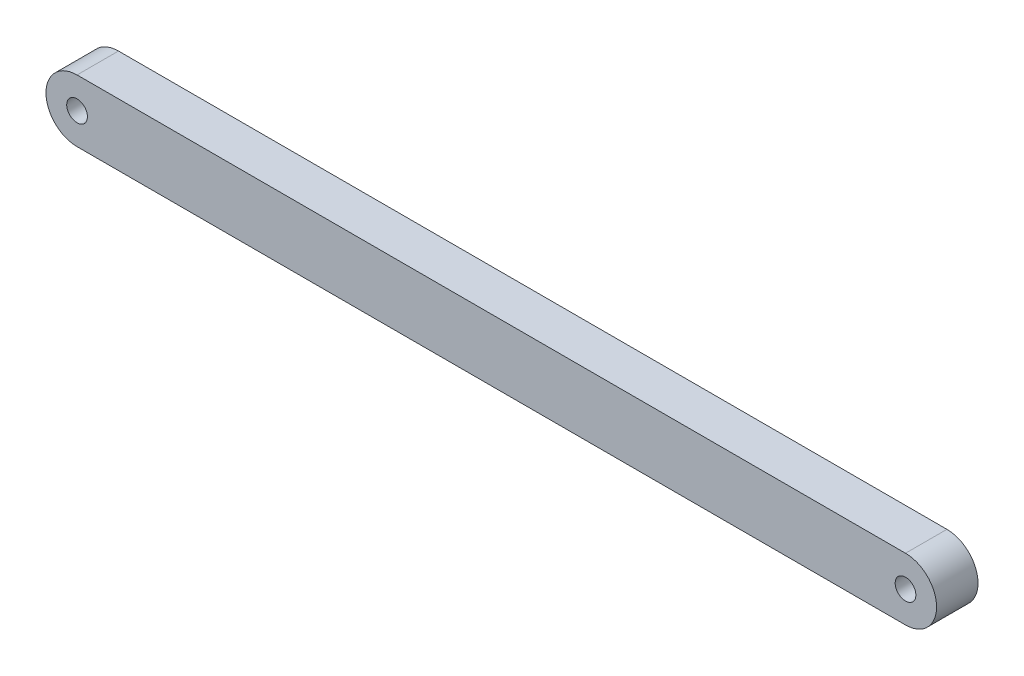
ISO-10303-21;
HEADER;
FILE_DESCRIPTION(('STEP AP214'),'2;1');
FILE_NAME('part.step','',(''),(''),'','','');
FILE_SCHEMA(('AUTOMOTIVE_DESIGN { 1 0 10303 214 1 1 1 1 }'));
ENDSEC;
DATA;
#1=APPLICATION_CONTEXT('core data for automotive mechanical design processes');
#2=APPLICATION_PROTOCOL_DEFINITION('international standard','automotive_design',2000,#1);
#3=PRODUCT_CONTEXT('',#1,'mechanical');
#4=PRODUCT('Part','Part','',(#3));
#5=PRODUCT_RELATED_PRODUCT_CATEGORY('part','',(#4));
#6=PRODUCT_DEFINITION_FORMATION('','',#4);
#7=PRODUCT_DEFINITION_CONTEXT('part definition',#1,'design');
#8=PRODUCT_DEFINITION('design','',#6,#7);
#9=PRODUCT_DEFINITION_SHAPE('','',#8);
#10=(LENGTH_UNIT() NAMED_UNIT(*) SI_UNIT(.MILLI.,.METRE.));
#11=(NAMED_UNIT(*) PLANE_ANGLE_UNIT() SI_UNIT($,.RADIAN.));
#12=(NAMED_UNIT(*) SI_UNIT($,.STERADIAN.) SOLID_ANGLE_UNIT());
#13=UNCERTAINTY_MEASURE_WITH_UNIT(LENGTH_MEASURE(1.E-05),#10,'distance_accuracy_value','');
#14=(GEOMETRIC_REPRESENTATION_CONTEXT(3) GLOBAL_UNCERTAINTY_ASSIGNED_CONTEXT((#13)) GLOBAL_UNIT_ASSIGNED_CONTEXT((#10,
#11,#12)) REPRESENTATION_CONTEXT('',''));
#15=CARTESIAN_POINT('',(0.,0.,0.));
#16=DIRECTION('',(0.,0.,1.));
#17=DIRECTION('',(1.,0.,0.));
#18=AXIS2_PLACEMENT_3D('',#15,#16,#17);
#19=CARTESIAN_POINT('',(-26.147603505701,20.515129689902,2.));
#20=DIRECTION('',(0.,0.,1.));
#21=DIRECTION('',(1.,0.,0.));
#22=AXIS2_PLACEMENT_3D('',#19,#20,#21);
#23=PLANE('',#22);
#24=CARTESIAN_POINT('',(-26.147603505701,20.515129689902,2.));
#25=DIRECTION('',(0.,0.,1.));
#26=DIRECTION('',(1.,0.,0.));
#27=AXIS2_PLACEMENT_3D('',#24,#25,#26);
#28=CIRCLE('',#27,0.499999999999999);
#29=CARTESIAN_POINT('',(-25.647603505701,20.515129689902,2.));
#30=VERTEX_POINT('',#29);
#31=EDGE_CURVE('E108',#30,#30,#28,.T.);
#32=ORIENTED_EDGE('',*,*,#31,.F.);
#33=EDGE_LOOP('',(#32));
#34=FACE_BOUND('',#33,.T.);
#35=CARTESIAN_POINT('',(-26.147603505701,20.515129689902,2.));
#36=DIRECTION('',(0.,0.,1.));
#37=DIRECTION('',(1.,0.,0.));
#38=AXIS2_PLACEMENT_3D('',#35,#36,#37);
#39=CIRCLE('',#38,1.5);
#40=CARTESIAN_POINT('',(-26.147603505701,22.015129689902,2.));
#41=VERTEX_POINT('',#40);
#42=CARTESIAN_POINT('',(-26.147603505701,19.015129689902,2.));
#43=VERTEX_POINT('',#42);
#44=EDGE_CURVE('E93',#41,#43,#39,.T.);
#45=ORIENTED_EDGE('',*,*,#44,.T.);
#46=DIRECTION('',(1.,0.,0.));
#47=VECTOR('',#46,1.);
#48=CARTESIAN_POINT('',(13.852396494299,19.015129689902,2.));
#49=LINE('',#48,#47);
#50=CARTESIAN_POINT('',(13.852396494299,19.015129689902,2.));
#51=VERTEX_POINT('',#50);
#52=EDGE_CURVE('E88',#43,#51,#49,.T.);
#53=ORIENTED_EDGE('',*,*,#52,.T.);
#54=CARTESIAN_POINT('',(13.852396494299,20.515129689902,2.));
#55=DIRECTION('',(0.,0.,1.));
#56=DIRECTION('',(1.,0.,0.));
#57=AXIS2_PLACEMENT_3D('',#54,#55,#56);
#58=CIRCLE('',#57,1.5);
#59=CARTESIAN_POINT('',(13.852396494299,22.015129689902,2.));
#60=VERTEX_POINT('',#59);
#61=EDGE_CURVE('E91',#51,#60,#58,.T.);
#62=ORIENTED_EDGE('',*,*,#61,.T.);
#63=DIRECTION('',(-1.,0.,0.));
#64=VECTOR('',#63,1.);
#65=CARTESIAN_POINT('',(-26.147603505701,22.015129689902,2.));
#66=LINE('',#65,#64);
#67=EDGE_CURVE('E58',#60,#41,#66,.T.);
#68=ORIENTED_EDGE('',*,*,#67,.T.);
#69=EDGE_LOOP('',(#45,#53,#62,#68));
#70=FACE_BOUND('',#69,.T.);
#71=CARTESIAN_POINT('',(13.852396494299,20.515129689902,2.));
#72=DIRECTION('',(0.,0.,1.));
#73=DIRECTION('',(1.,0.,0.));
#74=AXIS2_PLACEMENT_3D('',#71,#72,#73);
#75=CIRCLE('',#74,0.500000000000001);
#76=CARTESIAN_POINT('',(14.352396494299,20.515129689902,2.));
#77=VERTEX_POINT('',#76);
#78=EDGE_CURVE('E123',#77,#77,#75,.T.);
#79=ORIENTED_EDGE('',*,*,#78,.F.);
#80=EDGE_LOOP('',(#79));
#81=FACE_BOUND('',#80,.T.);
#82=ADVANCED_FACE('F41',(#34,#70,#81),#23,.T.);
#83=CARTESIAN_POINT('',(-26.147603505701,20.515129689902,0.));
#84=DIRECTION('',(0.,0.,1.));
#85=DIRECTION('',(1.,0.,0.));
#86=AXIS2_PLACEMENT_3D('',#83,#84,#85);
#87=PLANE('',#86);
#88=CARTESIAN_POINT('',(-26.147603505701,20.515129689902,0.));
#89=DIRECTION('',(0.,0.,1.));
#90=DIRECTION('',(1.,0.,0.));
#91=AXIS2_PLACEMENT_3D('',#88,#89,#90);
#92=CIRCLE('',#91,1.5);
#93=CARTESIAN_POINT('',(-26.147603505701,22.015129689902,0.));
#94=VERTEX_POINT('',#93);
#95=CARTESIAN_POINT('',(-26.147603505701,19.015129689902,0.));
#96=VERTEX_POINT('',#95);
#97=EDGE_CURVE('E105',#94,#96,#92,.T.);
#98=ORIENTED_EDGE('',*,*,#97,.F.);
#99=DIRECTION('',(-1.,0.,0.));
#100=VECTOR('',#99,1.);
#101=CARTESIAN_POINT('',(-26.147603505701,22.015129689902,0.));
#102=LINE('',#101,#100);
#103=CARTESIAN_POINT('',(13.852396494299,22.015129689902,0.));
#104=VERTEX_POINT('',#103);
#105=EDGE_CURVE('E81',#104,#94,#102,.T.);
#106=ORIENTED_EDGE('',*,*,#105,.F.);
#107=CARTESIAN_POINT('',(13.852396494299,20.515129689902,0.));
#108=DIRECTION('',(0.,0.,1.));
#109=DIRECTION('',(1.,0.,0.));
#110=AXIS2_PLACEMENT_3D('',#107,#108,#109);
#111=CIRCLE('',#110,1.5);
#112=CARTESIAN_POINT('',(13.852396494299,19.015129689902,0.));
#113=VERTEX_POINT('',#112);
#114=EDGE_CURVE('E75',#113,#104,#111,.T.);
#115=ORIENTED_EDGE('',*,*,#114,.F.);
#116=DIRECTION('',(1.,0.,0.));
#117=VECTOR('',#116,1.);
#118=CARTESIAN_POINT('',(13.852396494299,19.015129689902,0.));
#119=LINE('',#118,#117);
#120=EDGE_CURVE('E97',#96,#113,#119,.T.);
#121=ORIENTED_EDGE('',*,*,#120,.F.);
#122=EDGE_LOOP('',(#98,#106,#115,#121));
#123=FACE_BOUND('',#122,.T.);
#124=CARTESIAN_POINT('',(-26.147603505701,20.515129689902,0.));
#125=DIRECTION('',(0.,0.,1.));
#126=DIRECTION('',(1.,0.,0.));
#127=AXIS2_PLACEMENT_3D('',#124,#125,#126);
#128=CIRCLE('',#127,0.499999999999999);
#129=CARTESIAN_POINT('',(-25.647603505701,20.515129689902,0.));
#130=VERTEX_POINT('',#129);
#131=EDGE_CURVE('E120',#130,#130,#128,.T.);
#132=ORIENTED_EDGE('',*,*,#131,.T.);
#133=EDGE_LOOP('',(#132));
#134=FACE_BOUND('',#133,.T.);
#135=CARTESIAN_POINT('',(13.852396494299,20.515129689902,0.));
#136=DIRECTION('',(0.,0.,1.));
#137=DIRECTION('',(1.,0.,0.));
#138=AXIS2_PLACEMENT_3D('',#135,#136,#137);
#139=CIRCLE('',#138,0.500000000000001);
#140=CARTESIAN_POINT('',(14.352396494299,20.515129689902,0.));
#141=VERTEX_POINT('',#140);
#142=EDGE_CURVE('E126',#141,#141,#139,.T.);
#143=ORIENTED_EDGE('',*,*,#142,.T.);
#144=EDGE_LOOP('',(#143));
#145=FACE_BOUND('',#144,.T.);
#146=ADVANCED_FACE('F116',(#123,#134,#145),#87,.F.);
#147=CARTESIAN_POINT('',(-26.147603505701,20.515129689902,2.));
#148=DIRECTION('',(0.,0.,-1.));
#149=DIRECTION('',(-1.,0.,0.));
#150=AXIS2_PLACEMENT_3D('',#147,#148,#149);
#151=CYLINDRICAL_SURFACE('',#150,1.5);
#152=ORIENTED_EDGE('',*,*,#97,.T.);
#153=DIRECTION('',(0.,0.,-1.));
#154=VECTOR('',#153,1.);
#155=CARTESIAN_POINT('',(-26.147603505701,19.015129689902,2.));
#156=LINE('',#155,#154);
#157=EDGE_CURVE('E11',#43,#96,#156,.T.);
#158=ORIENTED_EDGE('',*,*,#157,.F.);
#159=ORIENTED_EDGE('',*,*,#44,.F.);
#160=DIRECTION('',(0.,0.,-1.));
#161=VECTOR('',#160,1.);
#162=CARTESIAN_POINT('',(-26.147603505701,22.015129689902,2.));
#163=LINE('',#162,#161);
#164=EDGE_CURVE('E101',#41,#94,#163,.T.);
#165=ORIENTED_EDGE('',*,*,#164,.T.);
#166=EDGE_LOOP('',(#152,#158,#159,#165));
#167=FACE_BOUND('',#166,.T.);
#168=ADVANCED_FACE('F43',(#167),#151,.T.);
#169=CARTESIAN_POINT('',(13.852396494299,19.015129689902,2.));
#170=DIRECTION('',(0.,1.,0.));
#171=DIRECTION('',(-1.,0.,0.));
#172=AXIS2_PLACEMENT_3D('',#169,#170,#171);
#173=PLANE('',#172);
#174=ORIENTED_EDGE('',*,*,#120,.T.);
#175=DIRECTION('',(0.,0.,-1.));
#176=VECTOR('',#175,1.);
#177=CARTESIAN_POINT('',(13.852396494299,19.015129689902,2.));
#178=LINE('',#177,#176);
#179=EDGE_CURVE('E50',#51,#113,#178,.T.);
#180=ORIENTED_EDGE('',*,*,#179,.F.);
#181=ORIENTED_EDGE('',*,*,#52,.F.);
#182=ORIENTED_EDGE('',*,*,#157,.T.);
#183=EDGE_LOOP('',(#174,#180,#181,#182));
#184=FACE_BOUND('',#183,.T.);
#185=ADVANCED_FACE('F96',(#184),#173,.F.);
#186=CARTESIAN_POINT('',(13.852396494299,20.515129689902,2.));
#187=DIRECTION('',(0.,0.,-1.));
#188=DIRECTION('',(-1.,0.,0.));
#189=AXIS2_PLACEMENT_3D('',#186,#187,#188);
#190=CYLINDRICAL_SURFACE('',#189,1.5);
#191=ORIENTED_EDGE('',*,*,#114,.T.);
#192=DIRECTION('',(0.,0.,-1.));
#193=VECTOR('',#192,1.);
#194=CARTESIAN_POINT('',(13.852396494299,22.015129689902,2.));
#195=LINE('',#194,#193);
#196=EDGE_CURVE('E98',#60,#104,#195,.T.);
#197=ORIENTED_EDGE('',*,*,#196,.F.);
#198=ORIENTED_EDGE('',*,*,#61,.F.);
#199=ORIENTED_EDGE('',*,*,#179,.T.);
#200=EDGE_LOOP('',(#191,#197,#198,#199));
#201=FACE_BOUND('',#200,.T.);
#202=ADVANCED_FACE('F99',(#201),#190,.T.);
#203=CARTESIAN_POINT('',(-26.147603505701,22.015129689902,2.));
#204=DIRECTION('',(0.,-1.,0.));
#205=DIRECTION('',(1.,0.,0.));
#206=AXIS2_PLACEMENT_3D('',#203,#204,#205);
#207=PLANE('',#206);
#208=ORIENTED_EDGE('',*,*,#105,.T.);
#209=ORIENTED_EDGE('',*,*,#164,.F.);
#210=ORIENTED_EDGE('',*,*,#67,.F.);
#211=ORIENTED_EDGE('',*,*,#196,.T.);
#212=EDGE_LOOP('',(#208,#209,#210,#211));
#213=FACE_BOUND('',#212,.T.);
#214=ADVANCED_FACE('F113',(#213),#207,.F.);
#215=CARTESIAN_POINT('',(-26.147603505701,20.515129689902,2.));
#216=DIRECTION('',(0.,0.,-1.));
#217=DIRECTION('',(-1.,0.,0.));
#218=AXIS2_PLACEMENT_3D('',#215,#216,#217);
#219=CYLINDRICAL_SURFACE('',#218,0.499999999999999);
#220=ORIENTED_EDGE('',*,*,#31,.T.);
#221=EDGE_LOOP('',(#220));
#222=FACE_BOUND('',#221,.T.);
#223=ORIENTED_EDGE('',*,*,#131,.F.);
#224=EDGE_LOOP('',(#223));
#225=FACE_BOUND('',#224,.T.);
#226=ADVANCED_FACE('F143',(#222,#225),#219,.F.);
#227=CARTESIAN_POINT('',(13.852396494299,20.515129689902,2.));
#228=DIRECTION('',(0.,0.,-1.));
#229=DIRECTION('',(-1.,0.,0.));
#230=AXIS2_PLACEMENT_3D('',#227,#228,#229);
#231=CYLINDRICAL_SURFACE('',#230,0.500000000000001);
#232=ORIENTED_EDGE('',*,*,#78,.T.);
#233=EDGE_LOOP('',(#232));
#234=FACE_BOUND('',#233,.T.);
#235=ORIENTED_EDGE('',*,*,#142,.F.);
#236=EDGE_LOOP('',(#235));
#237=FACE_BOUND('',#236,.T.);
#238=ADVANCED_FACE('F132',(#234,#237),#231,.F.);
#239=CLOSED_SHELL('',(#82,#146,#168,#185,#202,#214,#226,#238));
#240=MANIFOLD_SOLID_BREP('B2',#239);
#241=ADVANCED_BREP_SHAPE_REPRESENTATION('',(#18,#240),#14);
#242=SHAPE_DEFINITION_REPRESENTATION(#9,#241);
ENDSEC;
END-ISO-10303-21;
